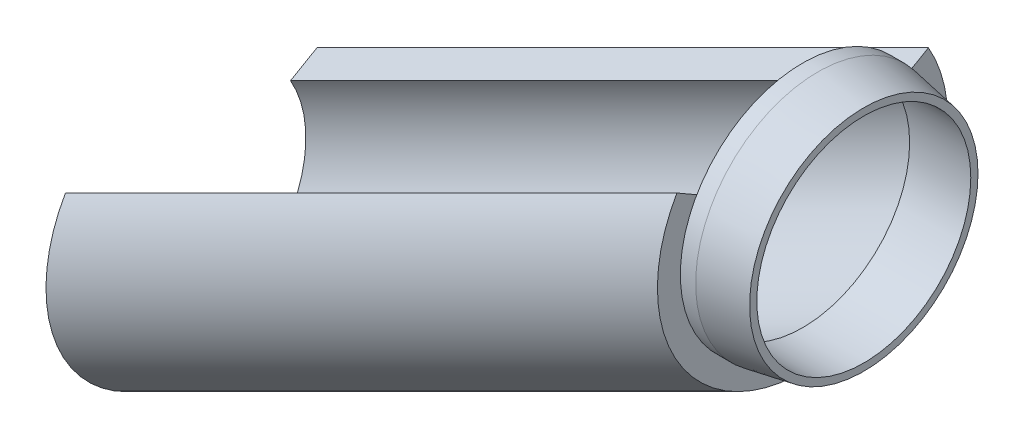
ISO-10303-21;
HEADER;
FILE_DESCRIPTION(('STEP AP214'),'2;1');
FILE_NAME('part.step','',(''),(''),'','','');
FILE_SCHEMA(('AUTOMOTIVE_DESIGN { 1 0 10303 214 1 1 1 1 }'));
ENDSEC;
DATA;
#1=APPLICATION_CONTEXT('core data for automotive mechanical design processes');
#2=APPLICATION_PROTOCOL_DEFINITION('international standard','automotive_design',2000,#1);
#3=PRODUCT_CONTEXT('',#1,'mechanical');
#4=PRODUCT('Part','Part','',(#3));
#5=PRODUCT_RELATED_PRODUCT_CATEGORY('part','',(#4));
#6=PRODUCT_DEFINITION_FORMATION('','',#4);
#7=PRODUCT_DEFINITION_CONTEXT('part definition',#1,'design');
#8=PRODUCT_DEFINITION('design','',#6,#7);
#9=PRODUCT_DEFINITION_SHAPE('','',#8);
#10=(LENGTH_UNIT() NAMED_UNIT(*) SI_UNIT(.MILLI.,.METRE.));
#11=(NAMED_UNIT(*) PLANE_ANGLE_UNIT() SI_UNIT($,.RADIAN.));
#12=(NAMED_UNIT(*) SI_UNIT($,.STERADIAN.) SOLID_ANGLE_UNIT());
#13=UNCERTAINTY_MEASURE_WITH_UNIT(LENGTH_MEASURE(1.E-05),#10,'distance_accuracy_value','');
#14=(GEOMETRIC_REPRESENTATION_CONTEXT(3) GLOBAL_UNCERTAINTY_ASSIGNED_CONTEXT((#13)) GLOBAL_UNIT_ASSIGNED_CONTEXT((#10,
#11,#12)) REPRESENTATION_CONTEXT('',''));
#15=CARTESIAN_POINT('',(0.,0.,0.));
#16=DIRECTION('',(0.,0.,1.));
#17=DIRECTION('',(1.,0.,0.));
#18=AXIS2_PLACEMENT_3D('',#15,#16,#17);
#19=CARTESIAN_POINT('',(4.,0.,0.));
#20=DIRECTION('',(1.,0.,0.));
#21=DIRECTION('',(0.,0.,-1.));
#22=AXIS2_PLACEMENT_3D('',#19,#20,#21);
#23=PLANE('',#22);
#24=CARTESIAN_POINT('',(4.,0.,0.));
#25=DIRECTION('',(1.,0.,0.));
#26=DIRECTION('',(0.,0.,-1.));
#27=AXIS2_PLACEMENT_3D('',#24,#25,#26);
#28=CIRCLE('',#27,7.47101905787461);
#29=CARTESIAN_POINT('',(4.,0.,-7.47101905787461));
#30=VERTEX_POINT('',#29);
#31=EDGE_CURVE('E57',#30,#30,#28,.T.);
#32=ORIENTED_EDGE('',*,*,#31,.T.);
#33=EDGE_LOOP('',(#32));
#34=FACE_BOUND('',#33,.T.);
#35=CARTESIAN_POINT('',(4.,0.,0.));
#36=DIRECTION('',(1.,0.,0.));
#37=DIRECTION('',(0.,0.,-1.));
#38=AXIS2_PLACEMENT_3D('',#35,#36,#37);
#39=CIRCLE('',#38,7.);
#40=CARTESIAN_POINT('',(4.,0.,-7.));
#41=VERTEX_POINT('',#40);
#42=EDGE_CURVE('E65',#41,#41,#39,.T.);
#43=ORIENTED_EDGE('',*,*,#42,.F.);
#44=EDGE_LOOP('',(#43));
#45=FACE_BOUND('',#44,.T.);
#46=ADVANCED_FACE('F49',(#34,#45),#23,.T.);
#47=CARTESIAN_POINT('',(0.,0.,0.));
#48=DIRECTION('',(1.,0.,0.));
#49=DIRECTION('',(0.,0.,-1.));
#50=AXIS2_PLACEMENT_3D('',#47,#48,#49);
#51=PLANE('',#50);
#52=CARTESIAN_POINT('',(0.,0.,0.));
#53=DIRECTION('',(1.,0.,0.));
#54=DIRECTION('',(0.,0.,-1.));
#55=AXIS2_PLACEMENT_3D('',#52,#53,#54);
#56=CIRCLE('',#55,8.);
#57=CARTESIAN_POINT('',(0.,0.,-8.));
#58=VERTEX_POINT('',#57);
#59=EDGE_CURVE('E61',#58,#58,#56,.T.);
#60=ORIENTED_EDGE('',*,*,#59,.F.);
#61=EDGE_LOOP('',(#60));
#62=FACE_BOUND('',#61,.T.);
#63=CARTESIAN_POINT('',(0.,0.,0.));
#64=DIRECTION('',(1.,0.,0.));
#65=DIRECTION('',(0.,0.,-1.));
#66=AXIS2_PLACEMENT_3D('',#63,#64,#65);
#67=CIRCLE('',#66,7.);
#68=CARTESIAN_POINT('',(0.,0.,-7.));
#69=VERTEX_POINT('',#68);
#70=EDGE_CURVE('E68',#69,#69,#67,.T.);
#71=ORIENTED_EDGE('',*,*,#70,.T.);
#72=EDGE_LOOP('',(#71));
#73=FACE_BOUND('',#72,.T.);
#74=ADVANCED_FACE('F78',(#62,#73),#51,.F.);
#75=CARTESIAN_POINT('',(4.,0.,0.));
#76=DIRECTION('',(-1.,0.,0.));
#77=DIRECTION('',(0.,0.,1.));
#78=AXIS2_PLACEMENT_3D('',#75,#76,#77);
#79=CYLINDRICAL_SURFACE('',#78,8.);
#80=CARTESIAN_POINT('',(0.99999999999998,0.,0.));
#81=DIRECTION('',(1.,0.,0.));
#82=DIRECTION('',(0.,0.,-1.));
#83=AXIS2_PLACEMENT_3D('',#80,#81,#82);
#84=CIRCLE('',#83,8.);
#85=CARTESIAN_POINT('',(0.99999999999998,0.,-8.));
#86=VERTEX_POINT('',#85);
#87=EDGE_CURVE('E12',#86,#86,#84,.F.);
#88=ORIENTED_EDGE('',*,*,#87,.T.);
#89=EDGE_LOOP('',(#88));
#90=FACE_BOUND('',#89,.T.);
#91=ORIENTED_EDGE('',*,*,#59,.T.);
#92=EDGE_LOOP('',(#91));
#93=FACE_BOUND('',#92,.T.);
#94=ADVANCED_FACE('F83',(#90,#93),#79,.T.);
#95=CARTESIAN_POINT('',(4.,0.,0.));
#96=DIRECTION('',(-1.,0.,0.));
#97=DIRECTION('',(0.,0.,1.));
#98=AXIS2_PLACEMENT_3D('',#95,#96,#97);
#99=CYLINDRICAL_SURFACE('',#98,7.);
#100=ORIENTED_EDGE('',*,*,#42,.T.);
#101=EDGE_LOOP('',(#100));
#102=FACE_BOUND('',#101,.T.);
#103=ORIENTED_EDGE('',*,*,#70,.F.);
#104=EDGE_LOOP('',(#103));
#105=FACE_BOUND('',#104,.T.);
#106=ADVANCED_FACE('F74',(#102,#105),#99,.F.);
#107=CARTESIAN_POINT('',(4.,0.,0.));
#108=DIRECTION('',(-1.,0.,0.));
#109=DIRECTION('',(0.,0.,1.));
#110=AXIS2_PLACEMENT_3D('',#107,#108,#109);
#111=CONICAL_SURFACE('',#110,7.47101905787461,0.174532925199431);
#112=ORIENTED_EDGE('',*,*,#87,.F.);
#113=EDGE_LOOP('',(#112));
#114=FACE_BOUND('',#113,.T.);
#115=ORIENTED_EDGE('',*,*,#31,.F.);
#116=EDGE_LOOP('',(#115));
#117=FACE_BOUND('',#116,.T.);
#118=ADVANCED_FACE('F52',(#114,#117),#111,.T.);
#119=CLOSED_SHELL('',(#46,#74,#94,#106,#118));
#120=MANIFOLD_SOLID_BREP('B2',#119);
#121=CARTESIAN_POINT('',(0.,0.,0.));
#122=DIRECTION('',(1.,0.,0.));
#123=DIRECTION('',(0.,0.,-1.));
#124=AXIS2_PLACEMENT_3D('',#121,#122,#123);
#125=PLANE('',#124);
#126=CARTESIAN_POINT('',(0.,0.,0.));
#127=DIRECTION('',(1.,0.,0.));
#128=DIRECTION('',(0.,0.,-1.));
#129=AXIS2_PLACEMENT_3D('',#126,#127,#128);
#130=CIRCLE('',#129,9.5);
#131=CARTESIAN_POINT('',(0.,4.75000000000003,8.22724133595214));
#132=VERTEX_POINT('',#131);
#133=CARTESIAN_POINT('',(0.,4.75000000000004,-8.22724133595214));
#134=VERTEX_POINT('',#133);
#135=EDGE_CURVE('E181',#132,#134,#130,.T.);
#136=ORIENTED_EDGE('',*,*,#135,.T.);
#137=DIRECTION('',(0.,-0.500000000000004,0.866025403784436));
#138=VECTOR('',#137,1.);
#139=CARTESIAN_POINT('',(0.,3.75000000000003,-6.49519052838327));
#140=LINE('',#139,#138);
#141=CARTESIAN_POINT('',(0.,3.75000000000004,-6.49519052838327));
#142=VERTEX_POINT('',#141);
#143=EDGE_CURVE('E174',#134,#142,#140,.T.);
#144=ORIENTED_EDGE('',*,*,#143,.T.);
#145=CARTESIAN_POINT('',(0.,0.,0.));
#146=DIRECTION('',(-1.,0.,0.));
#147=DIRECTION('',(0.,0.,-1.));
#148=AXIS2_PLACEMENT_3D('',#145,#146,#147);
#149=CIRCLE('',#148,7.5);
#150=CARTESIAN_POINT('',(0.,3.75000000000003,6.49519052838327));
#151=VERTEX_POINT('',#150);
#152=EDGE_CURVE('E169',#142,#151,#149,.T.);
#153=ORIENTED_EDGE('',*,*,#152,.T.);
#154=DIRECTION('',(0.,0.500000000000004,0.866025403784436));
#155=VECTOR('',#154,1.);
#156=CARTESIAN_POINT('',(0.,3.75000000000003,6.49519052838327));
#157=LINE('',#156,#155);
#158=EDGE_CURVE('E164',#151,#132,#157,.T.);
#159=ORIENTED_EDGE('',*,*,#158,.T.);
#160=EDGE_LOOP('',(#136,#144,#153,#159));
#161=FACE_BOUND('',#160,.T.);
#162=ADVANCED_FACE('F129',(#161),#125,.T.);
#163=CARTESIAN_POINT('',(-40.,-20.,0.));
#164=DIRECTION('',(1.,0.,0.));
#165=DIRECTION('',(0.,0.,-1.));
#166=AXIS2_PLACEMENT_3D('',#163,#164,#165);
#167=PLANE('',#166);
#168=CARTESIAN_POINT('',(-40.,-20.,0.));
#169=DIRECTION('',(1.,0.,0.));
#170=DIRECTION('',(0.,0.,-1.));
#171=AXIS2_PLACEMENT_3D('',#168,#169,#170);
#172=CIRCLE('',#171,9.5);
#173=CARTESIAN_POINT('',(-40.,-15.25,8.22724133595214));
#174=VERTEX_POINT('',#173);
#175=CARTESIAN_POINT('',(-40.,-15.25,-8.22724133595214));
#176=VERTEX_POINT('',#175);
#177=EDGE_CURVE('E189',#174,#176,#172,.T.);
#178=ORIENTED_EDGE('',*,*,#177,.F.);
#179=DIRECTION('',(0.,0.500000000000004,0.866025403784436));
#180=VECTOR('',#179,1.);
#181=CARTESIAN_POINT('',(-40.,-16.25,6.49519052838327));
#182=LINE('',#181,#180);
#183=CARTESIAN_POINT('',(-40.,-16.25,6.49519052838327));
#184=VERTEX_POINT('',#183);
#185=EDGE_CURVE('E47',#184,#174,#182,.T.);
#186=ORIENTED_EDGE('',*,*,#185,.F.);
#187=CARTESIAN_POINT('',(-40.,-20.,0.));
#188=DIRECTION('',(-1.,0.,0.));
#189=DIRECTION('',(0.,0.,-1.));
#190=AXIS2_PLACEMENT_3D('',#187,#188,#189);
#191=CIRCLE('',#190,7.5);
#192=CARTESIAN_POINT('',(-40.,-16.25,-6.49519052838327));
#193=VERTEX_POINT('',#192);
#194=EDGE_CURVE('E143',#193,#184,#191,.T.);
#195=ORIENTED_EDGE('',*,*,#194,.F.);
#196=DIRECTION('',(0.,-0.500000000000004,0.866025403784436));
#197=VECTOR('',#196,1.);
#198=CARTESIAN_POINT('',(-40.,-16.25,-6.49519052838327));
#199=LINE('',#198,#197);
#200=EDGE_CURVE('E152',#176,#193,#199,.T.);
#201=ORIENTED_EDGE('',*,*,#200,.F.);
#202=EDGE_LOOP('',(#178,#186,#195,#201));
#203=FACE_BOUND('',#202,.T.);
#204=ADVANCED_FACE('F218',(#203),#167,.F.);
#205=CARTESIAN_POINT('',(0.,4.75000000000003,8.22724133595214));
#206=CARTESIAN_POINT('',(-40.,-15.25,8.22724133595214));
#207=CARTESIAN_POINT('',(0.,-2.37499999999997,12.3408620039283));
#208=CARTESIAN_POINT('',(-40.,-22.375,12.3408620039283));
#209=CARTESIAN_POINT('',(0.,-9.5,8.22724133595219));
#210=CARTESIAN_POINT('',(-40.,-29.5,8.22724133595219));
#211=CARTESIAN_POINT('',(0.,-9.5,0.));
#212=CARTESIAN_POINT('',(-40.,-29.5,0.));
#213=CARTESIAN_POINT('',(0.,-9.5,-8.22724133595219));
#214=CARTESIAN_POINT('',(-40.,-29.5,-8.22724133595219));
#215=CARTESIAN_POINT('',(0.,-2.37499999999996,-12.3408620039283));
#216=CARTESIAN_POINT('',(-40.,-22.375,-12.3408620039283));
#217=CARTESIAN_POINT('',(0.,4.75000000000004,-8.22724133595214));
#218=CARTESIAN_POINT('',(-40.,-15.25,-8.22724133595214));
#219=(BOUNDED_SURFACE() B_SPLINE_SURFACE(3,1,((#205,#206),(#207,#208),(#209,#210),(#211,#212),
(#213,#214),(#215,#216),(#217,#218)),.UNSPECIFIED.,.F.,.F.,.F.) B_SPLINE_SURFACE_WITH_KNOTS((4,
3,4),(2,2),(0.,0.5,1.),(0.,1.),
.UNSPECIFIED.) GEOMETRIC_REPRESENTATION_ITEM() RATIONAL_B_SPLINE_SURFACE(((1.,1.),
(0.666666666666665,0.666666666666665),(0.666666666666665,0.666666666666665),(1.,1.),
(0.666666666666665,0.666666666666665),(0.666666666666665,0.666666666666665),(1.,1.))) REPRESENTATION_ITEM('') SURFACE());
#220=DIRECTION('',(-0.894427190999916,-0.447213595499958,0.));
#221=VECTOR('',#220,1.);
#222=CARTESIAN_POINT('',(0.,4.75000000000004,-8.22724133595214));
#223=LINE('',#222,#221);
#224=EDGE_CURVE('E184',#134,#176,#223,.T.);
#225=DIRECTION('',(-0.894427190999916,-0.447213595499958,0.));
#226=VECTOR('',#225,1.);
#227=CARTESIAN_POINT('',(0.,4.75000000000003,8.22724133595214));
#228=LINE('',#227,#226);
#229=EDGE_CURVE('E183',#132,#174,#228,.T.);
#230=ORIENTED_EDGE('',*,*,#224,.F.);
#231=ORIENTED_EDGE('',*,*,#135,.F.);
#232=ORIENTED_EDGE('',*,*,#229,.T.);
#233=ORIENTED_EDGE('',*,*,#177,.T.);
#234=EDGE_LOOP('',(#230,#231,#232,#233));
#235=FACE_BOUND('',#234,.T.);
#236=ADVANCED_FACE('F182',(#235),#219,.F.);
#237=CARTESIAN_POINT('',(0.,3.75000000000003,-6.49519052838327));
#238=DIRECTION('',(0.397359707119512,-0.794719414239024,-0.458831467741128));
#239=DIRECTION('',(0.,0.500000000000004,-0.866025403784436));
#240=AXIS2_PLACEMENT_3D('',#237,#238,#239);
#241=PLANE('',#240);
#242=DIRECTION('',(-0.894427190999916,-0.447213595499958,0.));
#243=VECTOR('',#242,1.);
#244=CARTESIAN_POINT('',(0.,3.75000000000004,-6.49519052838327));
#245=LINE('',#244,#243);
#246=EDGE_CURVE('E196',#142,#193,#245,.T.);
#247=ORIENTED_EDGE('',*,*,#246,.F.);
#248=ORIENTED_EDGE('',*,*,#143,.F.);
#249=ORIENTED_EDGE('',*,*,#224,.T.);
#250=ORIENTED_EDGE('',*,*,#200,.T.);
#251=EDGE_LOOP('',(#247,#248,#249,#250));
#252=FACE_BOUND('',#251,.T.);
#253=ADVANCED_FACE('F202',(#252),#241,.F.);
#254=CARTESIAN_POINT('',(0.,3.75000000000004,-6.49519052838327));
#255=CARTESIAN_POINT('',(-40.,-16.25,-6.49519052838327));
#256=CARTESIAN_POINT('',(0.,-1.87499999999997,-9.74278579257496));
#257=CARTESIAN_POINT('',(-40.,-21.875,-9.74278579257496));
#258=CARTESIAN_POINT('',(0.,-7.5,-6.49519052838332));
#259=CARTESIAN_POINT('',(-40.,-27.5,-6.49519052838332));
#260=CARTESIAN_POINT('',(0.,-7.5,0.));
#261=CARTESIAN_POINT('',(-40.,-27.5,0.));
#262=CARTESIAN_POINT('',(0.,-7.5,6.49519052838331));
#263=CARTESIAN_POINT('',(-40.,-27.5,6.49519052838331));
#264=CARTESIAN_POINT('',(0.,-1.87499999999997,9.74278579257495));
#265=CARTESIAN_POINT('',(-40.,-21.875,9.74278579257495));
#266=CARTESIAN_POINT('',(0.,3.75000000000003,6.49519052838327));
#267=CARTESIAN_POINT('',(-40.,-16.25,6.49519052838327));
#268=(BOUNDED_SURFACE() B_SPLINE_SURFACE(3,1,((#254,#255),(#256,#257),(#258,#259),(#260,#261),
(#262,#263),(#264,#265),(#266,#267)),.UNSPECIFIED.,.F.,.F.,.F.) B_SPLINE_SURFACE_WITH_KNOTS((4,
3,4),(2,2),(0.,0.5,1.),(0.,1.),
.UNSPECIFIED.) GEOMETRIC_REPRESENTATION_ITEM() RATIONAL_B_SPLINE_SURFACE(((1.,1.),
(0.666666666666665,0.666666666666665),(0.666666666666665,0.666666666666665),(1.,1.),
(0.666666666666665,0.666666666666665),(0.666666666666665,0.666666666666665),(1.,1.))) REPRESENTATION_ITEM('') SURFACE());
#269=DIRECTION('',(-0.894427190999916,-0.447213595499958,0.));
#270=VECTOR('',#269,1.);
#271=CARTESIAN_POINT('',(0.,3.75000000000003,6.49519052838327));
#272=LINE('',#271,#270);
#273=EDGE_CURVE('E136',#151,#184,#272,.T.);
#274=ORIENTED_EDGE('',*,*,#273,.F.);
#275=ORIENTED_EDGE('',*,*,#152,.F.);
#276=ORIENTED_EDGE('',*,*,#246,.T.);
#277=ORIENTED_EDGE('',*,*,#194,.T.);
#278=EDGE_LOOP('',(#274,#275,#276,#277));
#279=FACE_BOUND('',#278,.T.);
#280=ADVANCED_FACE('F200',(#279),#268,.F.);
#281=CARTESIAN_POINT('',(0.,3.75000000000003,6.49519052838327));
#282=DIRECTION('',(0.397359707119512,-0.794719414239024,0.458831467741127));
#283=DIRECTION('',(0.,-0.500000000000004,-0.866025403784436));
#284=AXIS2_PLACEMENT_3D('',#281,#282,#283);
#285=PLANE('',#284);
#286=ORIENTED_EDGE('',*,*,#185,.T.);
#287=ORIENTED_EDGE('',*,*,#229,.F.);
#288=ORIENTED_EDGE('',*,*,#158,.F.);
#289=ORIENTED_EDGE('',*,*,#273,.T.);
#290=EDGE_LOOP('',(#286,#287,#288,#289));
#291=FACE_BOUND('',#290,.T.);
#292=ADVANCED_FACE('F187',(#291),#285,.F.);
#293=CLOSED_SHELL('',(#162,#204,#236,#253,#280,#292));
#294=MANIFOLD_SOLID_BREP('B7',#293);
#295=ADVANCED_BREP_SHAPE_REPRESENTATION('',(#18,#120,#294),#14);
#296=SHAPE_DEFINITION_REPRESENTATION(#9,#295);
ENDSEC;
END-ISO-10303-21;
